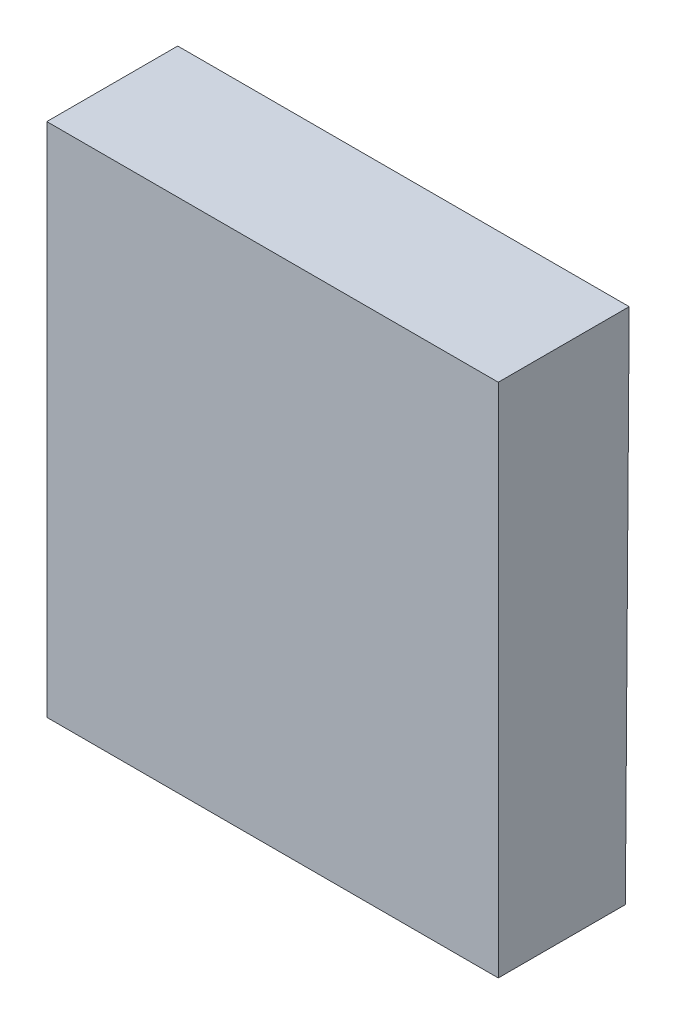
ISO-10303-21;
HEADER;
FILE_DESCRIPTION(('STEP AP214'),'2;1');
FILE_NAME('part.step','',(''),(''),'','','');
FILE_SCHEMA(('AUTOMOTIVE_DESIGN { 1 0 10303 214 1 1 1 1 }'));
ENDSEC;
DATA;
#1=APPLICATION_CONTEXT('core data for automotive mechanical design processes');
#2=APPLICATION_PROTOCOL_DEFINITION('international standard','automotive_design',2000,#1);
#3=PRODUCT_CONTEXT('',#1,'mechanical');
#4=PRODUCT('Part','Part','',(#3));
#5=PRODUCT_RELATED_PRODUCT_CATEGORY('part','',(#4));
#6=PRODUCT_DEFINITION_FORMATION('','',#4);
#7=PRODUCT_DEFINITION_CONTEXT('part definition',#1,'design');
#8=PRODUCT_DEFINITION('design','',#6,#7);
#9=PRODUCT_DEFINITION_SHAPE('','',#8);
#10=(LENGTH_UNIT() NAMED_UNIT(*) SI_UNIT(.MILLI.,.METRE.));
#11=(NAMED_UNIT(*) PLANE_ANGLE_UNIT() SI_UNIT($,.RADIAN.));
#12=(NAMED_UNIT(*) SI_UNIT($,.STERADIAN.) SOLID_ANGLE_UNIT());
#13=UNCERTAINTY_MEASURE_WITH_UNIT(LENGTH_MEASURE(1.E-05),#10,'distance_accuracy_value','');
#14=(GEOMETRIC_REPRESENTATION_CONTEXT(3) GLOBAL_UNCERTAINTY_ASSIGNED_CONTEXT((#13)) GLOBAL_UNIT_ASSIGNED_CONTEXT((#10,
#11,#12)) REPRESENTATION_CONTEXT('',''));
#15=CARTESIAN_POINT('',(0.,0.,0.));
#16=DIRECTION('',(0.,0.,1.));
#17=DIRECTION('',(1.,0.,0.));
#18=AXIS2_PLACEMENT_3D('',#15,#16,#17);
#19=CARTESIAN_POINT('',(-3.5,3.99999999999995,-9.2230938169189));
#20=DIRECTION('',(-1.,0.,0.));
#21=DIRECTION('',(0.,0.,1.));
#22=AXIS2_PLACEMENT_3D('',#19,#20,#21);
#23=PLANE('',#22);
#24=DIRECTION('',(0.,0.999972661192626,-0.00739438079474875));
#25=VECTOR('',#24,1.);
#26=CARTESIAN_POINT('',(-3.5,4.07838356411279,1.37703936196033));
#27=LINE('',#26,#25);
#28=CARTESIAN_POINT('',(-3.5,-3.99999999999995,1.43677563935801));
#29=VERTEX_POINT('',#28);
#30=CARTESIAN_POINT('',(-3.5,3.99999999999995,1.37761897572739));
#31=VERTEX_POINT('',#30);
#32=EDGE_CURVE('E47',#29,#31,#27,.T.);
#33=ORIENTED_EDGE('',*,*,#32,.F.);
#34=DIRECTION('',(0.,0.,1.));
#35=VECTOR('',#34,1.);
#36=CARTESIAN_POINT('',(-3.5,-3.99999999999995,-9.2230938169189));
#37=LINE('',#36,#35);
#38=CARTESIAN_POINT('',(-3.5,-3.99999999999995,3.40719730754273));
#39=VERTEX_POINT('',#38);
#40=EDGE_CURVE('E75',#29,#39,#37,.T.);
#41=ORIENTED_EDGE('',*,*,#40,.T.);
#42=DIRECTION('',(0.,-1.,0.));
#43=VECTOR('',#42,1.);
#44=CARTESIAN_POINT('',(-3.5,3.99999999999995,3.40719730754273));
#45=LINE('',#44,#43);
#46=CARTESIAN_POINT('',(-3.5,3.99999999999995,3.40719730754273));
#47=VERTEX_POINT('',#46);
#48=EDGE_CURVE('E79',#47,#39,#45,.T.);
#49=ORIENTED_EDGE('',*,*,#48,.F.);
#50=DIRECTION('',(0.,0.,1.));
#51=VECTOR('',#50,1.);
#52=CARTESIAN_POINT('',(-3.5,3.99999999999995,-9.2230938169189));
#53=LINE('',#52,#51);
#54=EDGE_CURVE('E102',#31,#47,#53,.T.);
#55=ORIENTED_EDGE('',*,*,#54,.F.);
#56=EDGE_LOOP('',(#33,#41,#49,#55));
#57=FACE_BOUND('',#56,.T.);
#58=ADVANCED_FACE('F39',(#57),#23,.T.);
#59=CARTESIAN_POINT('',(3.5,3.99999999999995,-9.2230938169189));
#60=DIRECTION('',(0.,1.,0.));
#61=DIRECTION('',(0.,0.,1.));
#62=AXIS2_PLACEMENT_3D('',#59,#60,#61);
#63=PLANE('',#62);
#64=DIRECTION('',(1.,0.,0.));
#65=VECTOR('',#64,1.);
#66=CARTESIAN_POINT('',(3.5,3.99999999999995,1.37761897572738));
#67=LINE('',#66,#65);
#68=CARTESIAN_POINT('',(3.5,3.99999999999995,1.37761897572738));
#69=VERTEX_POINT('',#68);
#70=EDGE_CURVE('E53',#31,#69,#67,.T.);
#71=ORIENTED_EDGE('',*,*,#70,.F.);
#72=ORIENTED_EDGE('',*,*,#54,.T.);
#73=DIRECTION('',(-1.,0.,0.));
#74=VECTOR('',#73,1.);
#75=CARTESIAN_POINT('',(3.5,3.99999999999995,3.40719730754273));
#76=LINE('',#75,#74);
#77=CARTESIAN_POINT('',(3.5,3.99999999999995,3.40719730754273));
#78=VERTEX_POINT('',#77);
#79=EDGE_CURVE('E84',#78,#47,#76,.T.);
#80=ORIENTED_EDGE('',*,*,#79,.F.);
#81=DIRECTION('',(0.,0.,1.));
#82=VECTOR('',#81,1.);
#83=CARTESIAN_POINT('',(3.5,3.99999999999995,-9.2230938169189));
#84=LINE('',#83,#82);
#85=EDGE_CURVE('E105',#69,#78,#84,.T.);
#86=ORIENTED_EDGE('',*,*,#85,.F.);
#87=EDGE_LOOP('',(#71,#72,#80,#86));
#88=FACE_BOUND('',#87,.T.);
#89=ADVANCED_FACE('F111',(#88),#63,.T.);
#90=CARTESIAN_POINT('',(3.5,3.99999999999995,-9.2230938169189));
#91=DIRECTION('',(1.,0.,0.));
#92=DIRECTION('',(0.,0.,-1.));
#93=AXIS2_PLACEMENT_3D('',#90,#91,#92);
#94=PLANE('',#93);
#95=DIRECTION('',(0.,-0.999972661192626,0.00739438079474875));
#96=VECTOR('',#95,1.);
#97=CARTESIAN_POINT('',(3.5,4.07838356411279,1.37703936196033));
#98=LINE('',#97,#96);
#99=CARTESIAN_POINT('',(3.5,-3.99999999999995,1.43677563935801));
#100=VERTEX_POINT('',#99);
#101=EDGE_CURVE('E104',#69,#100,#98,.T.);
#102=ORIENTED_EDGE('',*,*,#101,.F.);
#103=ORIENTED_EDGE('',*,*,#85,.T.);
#104=DIRECTION('',(0.,1.,0.));
#105=VECTOR('',#104,1.);
#106=CARTESIAN_POINT('',(3.5,3.99999999999995,3.40719730754273));
#107=LINE('',#106,#105);
#108=CARTESIAN_POINT('',(3.5,-3.99999999999995,3.40719730754273));
#109=VERTEX_POINT('',#108);
#110=EDGE_CURVE('E92',#109,#78,#107,.T.);
#111=ORIENTED_EDGE('',*,*,#110,.F.);
#112=DIRECTION('',(0.,0.,1.));
#113=VECTOR('',#112,1.);
#114=CARTESIAN_POINT('',(3.5,-3.99999999999995,-9.2230938169189));
#115=LINE('',#114,#113);
#116=EDGE_CURVE('E83',#100,#109,#115,.T.);
#117=ORIENTED_EDGE('',*,*,#116,.F.);
#118=EDGE_LOOP('',(#102,#103,#111,#117));
#119=FACE_BOUND('',#118,.T.);
#120=ADVANCED_FACE('F109',(#119),#94,.T.);
#121=CARTESIAN_POINT('',(3.5,-3.99999999999995,-9.2230938169189));
#122=DIRECTION('',(0.,-1.,0.));
#123=DIRECTION('',(0.,0.,-1.));
#124=AXIS2_PLACEMENT_3D('',#121,#122,#123);
#125=PLANE('',#124);
#126=DIRECTION('',(-1.,0.,0.));
#127=VECTOR('',#126,1.);
#128=CARTESIAN_POINT('',(3.5,-3.99999999999995,1.43677563935801));
#129=LINE('',#128,#127);
#130=EDGE_CURVE('E11',#100,#29,#129,.T.);
#131=ORIENTED_EDGE('',*,*,#130,.F.);
#132=ORIENTED_EDGE('',*,*,#116,.T.);
#133=DIRECTION('',(1.,0.,0.));
#134=VECTOR('',#133,1.);
#135=CARTESIAN_POINT('',(3.5,-3.99999999999995,3.40719730754273));
#136=LINE('',#135,#134);
#137=EDGE_CURVE('E86',#39,#109,#136,.T.);
#138=ORIENTED_EDGE('',*,*,#137,.F.);
#139=ORIENTED_EDGE('',*,*,#40,.F.);
#140=EDGE_LOOP('',(#131,#132,#138,#139));
#141=FACE_BOUND('',#140,.T.);
#142=ADVANCED_FACE('F87',(#141),#125,.T.);
#143=CARTESIAN_POINT('',(0.,0.,3.40719730754273));
#144=DIRECTION('',(0.,0.,-1.));
#145=DIRECTION('',(-1.,0.,0.));
#146=AXIS2_PLACEMENT_3D('',#143,#144,#145);
#147=PLANE('',#146);
#148=ORIENTED_EDGE('',*,*,#48,.T.);
#149=ORIENTED_EDGE('',*,*,#137,.T.);
#150=ORIENTED_EDGE('',*,*,#110,.T.);
#151=ORIENTED_EDGE('',*,*,#79,.T.);
#152=EDGE_LOOP('',(#148,#149,#150,#151));
#153=FACE_BOUND('',#152,.T.);
#154=ADVANCED_FACE('F94',(#153),#147,.F.);
#155=CARTESIAN_POINT('',(3.,2.47352985641037,1.3889065858307));
#156=DIRECTION('',(0.,0.00739438079474874,0.999972661192626));
#157=DIRECTION('',(0.,-0.999972661192626,0.00739438079474874));
#158=AXIS2_PLACEMENT_3D('',#155,#156,#157);
#159=PLANE('',#158);
#160=ORIENTED_EDGE('',*,*,#32,.T.);
#161=ORIENTED_EDGE('',*,*,#70,.T.);
#162=ORIENTED_EDGE('',*,*,#101,.T.);
#163=ORIENTED_EDGE('',*,*,#130,.T.);
#164=EDGE_LOOP('',(#160,#161,#162,#163));
#165=FACE_BOUND('',#164,.T.);
#166=ADVANCED_FACE('F113',(#165),#159,.F.);
#167=CLOSED_SHELL('',(#58,#89,#120,#142,#154,#166));
#168=MANIFOLD_SOLID_BREP('B2',#167);
#169=ADVANCED_BREP_SHAPE_REPRESENTATION('',(#18,#168),#14);
#170=SHAPE_DEFINITION_REPRESENTATION(#9,#169);
ENDSEC;
END-ISO-10303-21;
